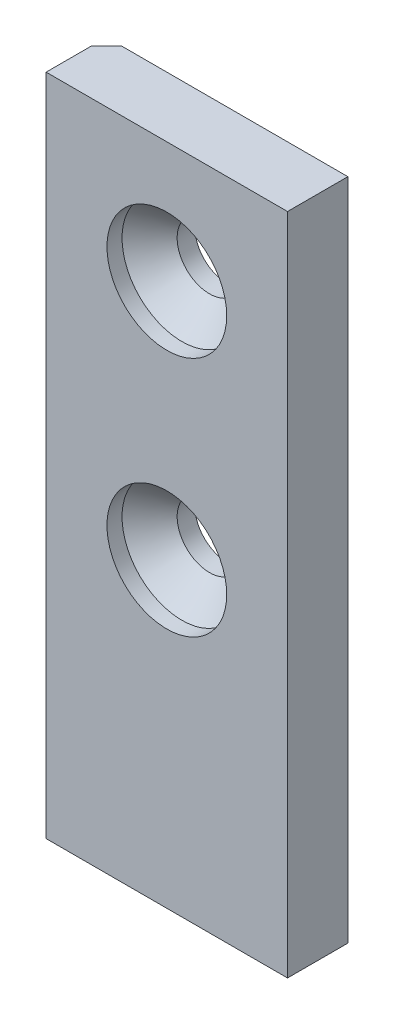
ISO-10303-21;
HEADER;
FILE_DESCRIPTION(('STEP AP214'),'2;1');
FILE_NAME('part.step','',(''),(''),'','','');
FILE_SCHEMA(('AUTOMOTIVE_DESIGN { 1 0 10303 214 1 1 1 1 }'));
ENDSEC;
DATA;
#1=APPLICATION_CONTEXT('core data for automotive mechanical design processes');
#2=APPLICATION_PROTOCOL_DEFINITION('international standard','automotive_design',2000,#1);
#3=PRODUCT_CONTEXT('',#1,'mechanical');
#4=PRODUCT('Part','Part','',(#3));
#5=PRODUCT_RELATED_PRODUCT_CATEGORY('part','',(#4));
#6=PRODUCT_DEFINITION_FORMATION('','',#4);
#7=PRODUCT_DEFINITION_CONTEXT('part definition',#1,'design');
#8=PRODUCT_DEFINITION('design','',#6,#7);
#9=PRODUCT_DEFINITION_SHAPE('','',#8);
#10=(LENGTH_UNIT() NAMED_UNIT(*) SI_UNIT(.MILLI.,.METRE.));
#11=(NAMED_UNIT(*) PLANE_ANGLE_UNIT() SI_UNIT($,.RADIAN.));
#12=(NAMED_UNIT(*) SI_UNIT($,.STERADIAN.) SOLID_ANGLE_UNIT());
#13=UNCERTAINTY_MEASURE_WITH_UNIT(LENGTH_MEASURE(1.E-05),#10,'distance_accuracy_value','');
#14=(GEOMETRIC_REPRESENTATION_CONTEXT(3) GLOBAL_UNCERTAINTY_ASSIGNED_CONTEXT((#13)) GLOBAL_UNIT_ASSIGNED_CONTEXT((#10,
#11,#12)) REPRESENTATION_CONTEXT('',''));
#15=CARTESIAN_POINT('',(0.,0.,0.));
#16=DIRECTION('',(0.,0.,1.));
#17=DIRECTION('',(1.,0.,0.));
#18=AXIS2_PLACEMENT_3D('',#15,#16,#17);
#19=CARTESIAN_POINT('',(-6.35000000000001,17.4624999999997,3.17500000000004));
#20=DIRECTION('',(1.,0.,0.));
#21=DIRECTION('',(0.,0.,-1.));
#22=AXIS2_PLACEMENT_3D('',#19,#20,#21);
#23=PLANE('',#22);
#24=DIRECTION('',(0.,0.707106781186547,0.707106781186548));
#25=VECTOR('',#24,1.);
#26=CARTESIAN_POINT('',(-6.35000000000001,18.6531250000002,1.98437500000004));
#27=LINE('',#26,#25);
#28=CARTESIAN_POINT('',(-6.35000000000001,16.66875,0.));
#29=VERTEX_POINT('',#28);
#30=CARTESIAN_POINT('',(-6.35000000000001,17.4624999999997,0.793750000000037));
#31=VERTEX_POINT('',#30);
#32=EDGE_CURVE('E101',#29,#31,#27,.T.);
#33=ORIENTED_EDGE('',*,*,#32,.F.);
#34=DIRECTION('',(0.,-1.,0.));
#35=VECTOR('',#34,1.);
#36=CARTESIAN_POINT('',(-6.35000000000001,17.4624999999997,0.));
#37=LINE('',#36,#35);
#38=CARTESIAN_POINT('',(-6.35,-17.4624999999997,0.));
#39=VERTEX_POINT('',#38);
#40=EDGE_CURVE('E90',#29,#39,#37,.T.);
#41=ORIENTED_EDGE('',*,*,#40,.T.);
#42=DIRECTION('',(0.,0.,-1.));
#43=VECTOR('',#42,1.);
#44=CARTESIAN_POINT('',(-6.35,-17.4624999999997,3.17500000000004));
#45=LINE('',#44,#43);
#46=CARTESIAN_POINT('',(-6.35,-17.4624999999997,3.17500000000004));
#47=VERTEX_POINT('',#46);
#48=EDGE_CURVE('E105',#47,#39,#45,.T.);
#49=ORIENTED_EDGE('',*,*,#48,.F.);
#50=DIRECTION('',(0.,-1.,0.));
#51=VECTOR('',#50,1.);
#52=CARTESIAN_POINT('',(-6.35000000000001,17.4624999999997,3.17500000000004));
#53=LINE('',#52,#51);
#54=CARTESIAN_POINT('',(-6.35000000000001,17.4624999999997,3.17500000000004));
#55=VERTEX_POINT('',#54);
#56=EDGE_CURVE('E120',#55,#47,#53,.T.);
#57=ORIENTED_EDGE('',*,*,#56,.F.);
#58=DIRECTION('',(0.,0.,-1.));
#59=VECTOR('',#58,1.);
#60=CARTESIAN_POINT('',(-6.35000000000001,17.4624999999997,3.17500000000004));
#61=LINE('',#60,#59);
#62=EDGE_CURVE('E103',#55,#31,#61,.T.);
#63=ORIENTED_EDGE('',*,*,#62,.T.);
#64=EDGE_LOOP('',(#33,#41,#49,#57,#63));
#65=FACE_BOUND('',#64,.T.);
#66=ADVANCED_FACE('F47',(#65),#23,.F.);
#67=CARTESIAN_POINT('',(-6.35,-17.4624999999997,3.17500000000004));
#68=DIRECTION('',(0.,1.,0.));
#69=DIRECTION('',(0.,0.,1.));
#70=AXIS2_PLACEMENT_3D('',#67,#68,#69);
#71=PLANE('',#70);
#72=DIRECTION('',(1.,0.,0.));
#73=VECTOR('',#72,1.);
#74=CARTESIAN_POINT('',(-6.35,-17.4624999999997,0.));
#75=LINE('',#74,#73);
#76=CARTESIAN_POINT('',(6.35000000000001,-17.4624999999997,0.));
#77=VERTEX_POINT('',#76);
#78=EDGE_CURVE('E94',#39,#77,#75,.T.);
#79=ORIENTED_EDGE('',*,*,#78,.T.);
#80=DIRECTION('',(0.,0.,-1.));
#81=VECTOR('',#80,1.);
#82=CARTESIAN_POINT('',(6.35000000000001,-17.4624999999997,3.17500000000004));
#83=LINE('',#82,#81);
#84=CARTESIAN_POINT('',(6.35000000000001,-17.4624999999997,3.17500000000004));
#85=VERTEX_POINT('',#84);
#86=EDGE_CURVE('E110',#85,#77,#83,.T.);
#87=ORIENTED_EDGE('',*,*,#86,.F.);
#88=DIRECTION('',(1.,0.,0.));
#89=VECTOR('',#88,1.);
#90=CARTESIAN_POINT('',(-6.35,-17.4624999999997,3.17500000000004));
#91=LINE('',#90,#89);
#92=EDGE_CURVE('E127',#47,#85,#91,.T.);
#93=ORIENTED_EDGE('',*,*,#92,.F.);
#94=ORIENTED_EDGE('',*,*,#48,.T.);
#95=EDGE_LOOP('',(#79,#87,#93,#94));
#96=FACE_BOUND('',#95,.T.);
#97=ADVANCED_FACE('F167',(#96),#71,.F.);
#98=CARTESIAN_POINT('',(6.35000000000001,17.4624999999997,3.17500000000004));
#99=DIRECTION('',(-1.,0.,0.));
#100=DIRECTION('',(0.,0.,1.));
#101=AXIS2_PLACEMENT_3D('',#98,#99,#100);
#102=PLANE('',#101);
#103=DIRECTION('',(0.,1.,0.));
#104=VECTOR('',#103,1.);
#105=CARTESIAN_POINT('',(6.35000000000001,17.4624999999997,0.));
#106=LINE('',#105,#104);
#107=CARTESIAN_POINT('',(6.35000000000001,17.4624999999997,0.));
#108=VERTEX_POINT('',#107);
#109=EDGE_CURVE('E121',#77,#108,#106,.T.);
#110=ORIENTED_EDGE('',*,*,#109,.T.);
#111=DIRECTION('',(0.,0.,-1.));
#112=VECTOR('',#111,1.);
#113=CARTESIAN_POINT('',(6.35000000000001,17.4624999999997,3.17500000000004));
#114=LINE('',#113,#112);
#115=CARTESIAN_POINT('',(6.35000000000001,17.4624999999997,3.17500000000004));
#116=VERTEX_POINT('',#115);
#117=EDGE_CURVE('E113',#116,#108,#114,.T.);
#118=ORIENTED_EDGE('',*,*,#117,.F.);
#119=DIRECTION('',(0.,1.,0.));
#120=VECTOR('',#119,1.);
#121=CARTESIAN_POINT('',(6.35000000000001,17.4624999999997,3.17500000000004));
#122=LINE('',#121,#120);
#123=EDGE_CURVE('E125',#85,#116,#122,.T.);
#124=ORIENTED_EDGE('',*,*,#123,.F.);
#125=ORIENTED_EDGE('',*,*,#86,.T.);
#126=EDGE_LOOP('',(#110,#118,#124,#125));
#127=FACE_BOUND('',#126,.T.);
#128=ADVANCED_FACE('F171',(#127),#102,.F.);
#129=CARTESIAN_POINT('',(-6.35000000000001,17.4624999999997,3.17500000000004));
#130=DIRECTION('',(0.,-1.,0.));
#131=DIRECTION('',(0.,0.,-1.));
#132=AXIS2_PLACEMENT_3D('',#129,#130,#131);
#133=PLANE('',#132);
#134=DIRECTION('',(0.707106781186548,0.,-0.707106781186547));
#135=VECTOR('',#134,1.);
#136=CARTESIAN_POINT('',(-7.54062500000001,17.4624999999997,1.98437500000004));
#137=LINE('',#136,#135);
#138=CARTESIAN_POINT('',(-5.55625,17.4624999999997,0.));
#139=VERTEX_POINT('',#138);
#140=EDGE_CURVE('E54',#31,#139,#137,.T.);
#141=ORIENTED_EDGE('',*,*,#140,.F.);
#142=ORIENTED_EDGE('',*,*,#62,.F.);
#143=DIRECTION('',(-1.,0.,0.));
#144=VECTOR('',#143,1.);
#145=CARTESIAN_POINT('',(-6.35000000000001,17.4624999999997,3.17500000000004));
#146=LINE('',#145,#144);
#147=EDGE_CURVE('E117',#116,#55,#146,.T.);
#148=ORIENTED_EDGE('',*,*,#147,.F.);
#149=ORIENTED_EDGE('',*,*,#117,.T.);
#150=DIRECTION('',(-1.,0.,0.));
#151=VECTOR('',#150,1.);
#152=CARTESIAN_POINT('',(-6.35000000000001,17.4624999999997,0.));
#153=LINE('',#152,#151);
#154=EDGE_CURVE('E118',#108,#139,#153,.T.);
#155=ORIENTED_EDGE('',*,*,#154,.T.);
#156=EDGE_LOOP('',(#141,#142,#148,#149,#155));
#157=FACE_BOUND('',#156,.T.);
#158=ADVANCED_FACE('F160',(#157),#133,.F.);
#159=CARTESIAN_POINT('',(0.,0.,3.17500000000004));
#160=DIRECTION('',(0.,0.,1.));
#161=DIRECTION('',(1.,0.,0.));
#162=AXIS2_PLACEMENT_3D('',#159,#160,#161);
#163=PLANE('',#162);
#164=CARTESIAN_POINT('',(0.,-1.5875000000003,3.17500000000004));
#165=DIRECTION('',(0.,0.,1.));
#166=DIRECTION('',(1.,0.,0.));
#167=AXIS2_PLACEMENT_3D('',#164,#165,#166);
#168=CIRCLE('',#167,3.15);
#169=CARTESIAN_POINT('',(3.15,-1.5875000000003,3.17500000000004));
#170=VERTEX_POINT('',#169);
#171=EDGE_CURVE('E151',#170,#170,#168,.T.);
#172=ORIENTED_EDGE('',*,*,#171,.F.);
#173=EDGE_LOOP('',(#172));
#174=FACE_BOUND('',#173,.T.);
#175=CARTESIAN_POINT('',(0.,11.1125000000003,3.17500000000004));
#176=DIRECTION('',(0.,0.,1.));
#177=DIRECTION('',(1.,0.,0.));
#178=AXIS2_PLACEMENT_3D('',#175,#176,#177);
#179=CIRCLE('',#178,3.15);
#180=CARTESIAN_POINT('',(3.15,11.1125000000003,3.17500000000004));
#181=VERTEX_POINT('',#180);
#182=EDGE_CURVE('E139',#181,#181,#179,.T.);
#183=ORIENTED_EDGE('',*,*,#182,.F.);
#184=EDGE_LOOP('',(#183));
#185=FACE_BOUND('',#184,.T.);
#186=ORIENTED_EDGE('',*,*,#56,.T.);
#187=ORIENTED_EDGE('',*,*,#92,.T.);
#188=ORIENTED_EDGE('',*,*,#123,.T.);
#189=ORIENTED_EDGE('',*,*,#147,.T.);
#190=EDGE_LOOP('',(#186,#187,#188,#189));
#191=FACE_BOUND('',#190,.T.);
#192=ADVANCED_FACE('F157',(#174,#185,#191),#163,.T.);
#193=CARTESIAN_POINT('',(0.,0.,0.));
#194=DIRECTION('',(0.,0.,1.));
#195=DIRECTION('',(1.,0.,0.));
#196=AXIS2_PLACEMENT_3D('',#193,#194,#195);
#197=PLANE('',#196);
#198=CARTESIAN_POINT('',(0.,-1.5875000000003,0.));
#199=DIRECTION('',(0.,0.,1.));
#200=DIRECTION('',(1.,0.,0.));
#201=AXIS2_PLACEMENT_3D('',#198,#199,#200);
#202=CIRCLE('',#201,1.70000000000001);
#203=CARTESIAN_POINT('',(1.70000000000001,-1.5875000000003,0.));
#204=VERTEX_POINT('',#203);
#205=EDGE_CURVE('E142',#204,#204,#202,.T.);
#206=ORIENTED_EDGE('',*,*,#205,.T.);
#207=EDGE_LOOP('',(#206));
#208=FACE_BOUND('',#207,.T.);
#209=CARTESIAN_POINT('',(0.,11.1125000000003,0.));
#210=DIRECTION('',(0.,0.,1.));
#211=DIRECTION('',(1.,0.,0.));
#212=AXIS2_PLACEMENT_3D('',#209,#210,#211);
#213=CIRCLE('',#212,1.70000000000001);
#214=CARTESIAN_POINT('',(1.70000000000001,11.1125000000003,0.));
#215=VERTEX_POINT('',#214);
#216=EDGE_CURVE('E98',#215,#215,#213,.T.);
#217=ORIENTED_EDGE('',*,*,#216,.T.);
#218=EDGE_LOOP('',(#217));
#219=FACE_BOUND('',#218,.T.);
#220=DIRECTION('',(-0.707106781186548,-0.707106781186547,0.));
#221=VECTOR('',#220,1.);
#222=CARTESIAN_POINT('',(-11.509375,11.5093750000002,0.));
#223=LINE('',#222,#221);
#224=EDGE_CURVE('E12',#139,#29,#223,.T.);
#225=ORIENTED_EDGE('',*,*,#224,.F.);
#226=ORIENTED_EDGE('',*,*,#154,.F.);
#227=ORIENTED_EDGE('',*,*,#109,.F.);
#228=ORIENTED_EDGE('',*,*,#78,.F.);
#229=ORIENTED_EDGE('',*,*,#40,.F.);
#230=EDGE_LOOP('',(#225,#226,#227,#228,#229));
#231=FACE_BOUND('',#230,.T.);
#232=ADVANCED_FACE('F92',(#208,#219,#231),#197,.F.);
#233=CARTESIAN_POINT('',(-7.67291666666668,7.67291666666647,-7.6729166666667));
#234=DIRECTION('',(-0.577350269189625,0.577350269189627,-0.577350269189626));
#235=DIRECTION('',(0.,0.707106781186547,0.707106781186548));
#236=AXIS2_PLACEMENT_3D('',#233,#234,#235);
#237=PLANE('',#236);
#238=ORIENTED_EDGE('',*,*,#224,.T.);
#239=ORIENTED_EDGE('',*,*,#32,.T.);
#240=ORIENTED_EDGE('',*,*,#140,.T.);
#241=EDGE_LOOP('',(#238,#239,#240));
#242=FACE_BOUND('',#241,.T.);
#243=ADVANCED_FACE('F107',(#242),#237,.T.);
#244=CARTESIAN_POINT('',(0.,11.1125000000003,3.17500000000004));
#245=DIRECTION('',(0.,0.,1.));
#246=DIRECTION('',(1.,0.,0.));
#247=AXIS2_PLACEMENT_3D('',#244,#245,#246);
#248=CYLINDRICAL_SURFACE('',#247,1.70000000000001);
#249=ORIENTED_EDGE('',*,*,#216,.F.);
#250=EDGE_LOOP('',(#249));
#251=FACE_BOUND('',#250,.T.);
#252=CARTESIAN_POINT('',(0.,11.1125000000003,0.93125000000005));
#253=DIRECTION('',(0.,0.,1.));
#254=DIRECTION('',(1.,0.,0.));
#255=AXIS2_PLACEMENT_3D('',#252,#253,#254);
#256=CIRCLE('',#255,1.7);
#257=CARTESIAN_POINT('',(1.7,11.1125000000003,0.93125000000005));
#258=VERTEX_POINT('',#257);
#259=EDGE_CURVE('E133',#258,#258,#256,.T.);
#260=ORIENTED_EDGE('',*,*,#259,.T.);
#261=EDGE_LOOP('',(#260));
#262=FACE_BOUND('',#261,.T.);
#263=ADVANCED_FACE('F210',(#251,#262),#248,.F.);
#264=CARTESIAN_POINT('',(0.,11.1125000000003,2.38125));
#265=DIRECTION('',(0.,0.,1.));
#266=DIRECTION('',(1.,0.,0.));
#267=AXIS2_PLACEMENT_3D('',#264,#265,#266);
#268=CONICAL_SURFACE('',#267,3.15,0.785398163397449);
#269=ORIENTED_EDGE('',*,*,#259,.F.);
#270=EDGE_LOOP('',(#269));
#271=FACE_BOUND('',#270,.T.);
#272=CARTESIAN_POINT('',(0.,11.1125000000003,2.38125));
#273=DIRECTION('',(0.,0.,1.));
#274=DIRECTION('',(1.,0.,0.));
#275=AXIS2_PLACEMENT_3D('',#272,#273,#274);
#276=CIRCLE('',#275,3.15);
#277=CARTESIAN_POINT('',(3.15,11.1125000000003,2.38125));
#278=VERTEX_POINT('',#277);
#279=EDGE_CURVE('E136',#278,#278,#276,.T.);
#280=ORIENTED_EDGE('',*,*,#279,.T.);
#281=EDGE_LOOP('',(#280));
#282=FACE_BOUND('',#281,.T.);
#283=ADVANCED_FACE('F217',(#271,#282),#268,.F.);
#284=CARTESIAN_POINT('',(0.,11.1125000000003,3.17500000000004));
#285=DIRECTION('',(0.,0.,1.));
#286=DIRECTION('',(1.,0.,0.));
#287=AXIS2_PLACEMENT_3D('',#284,#285,#286);
#288=CYLINDRICAL_SURFACE('',#287,3.15);
#289=ORIENTED_EDGE('',*,*,#279,.F.);
#290=EDGE_LOOP('',(#289));
#291=FACE_BOUND('',#290,.T.);
#292=ORIENTED_EDGE('',*,*,#182,.T.);
#293=EDGE_LOOP('',(#292));
#294=FACE_BOUND('',#293,.T.);
#295=ADVANCED_FACE('F225',(#291,#294),#288,.F.);
#296=CARTESIAN_POINT('',(0.,-1.5875000000003,3.17500000000004));
#297=DIRECTION('',(0.,0.,1.));
#298=DIRECTION('',(1.,0.,0.));
#299=AXIS2_PLACEMENT_3D('',#296,#297,#298);
#300=CYLINDRICAL_SURFACE('',#299,1.70000000000001);
#301=ORIENTED_EDGE('',*,*,#205,.F.);
#302=EDGE_LOOP('',(#301));
#303=FACE_BOUND('',#302,.T.);
#304=CARTESIAN_POINT('',(0.,-1.5875000000003,0.93125000000005));
#305=DIRECTION('',(0.,0.,1.));
#306=DIRECTION('',(1.,0.,0.));
#307=AXIS2_PLACEMENT_3D('',#304,#305,#306);
#308=CIRCLE('',#307,1.7);
#309=CARTESIAN_POINT('',(1.7,-1.5875000000003,0.93125000000005));
#310=VERTEX_POINT('',#309);
#311=EDGE_CURVE('E145',#310,#310,#308,.T.);
#312=ORIENTED_EDGE('',*,*,#311,.T.);
#313=EDGE_LOOP('',(#312));
#314=FACE_BOUND('',#313,.T.);
#315=ADVANCED_FACE('F233',(#303,#314),#300,.F.);
#316=CARTESIAN_POINT('',(0.,-1.5875000000003,2.38125));
#317=DIRECTION('',(0.,0.,1.));
#318=DIRECTION('',(1.,0.,0.));
#319=AXIS2_PLACEMENT_3D('',#316,#317,#318);
#320=CONICAL_SURFACE('',#319,3.15,0.785398163397449);
#321=ORIENTED_EDGE('',*,*,#311,.F.);
#322=EDGE_LOOP('',(#321));
#323=FACE_BOUND('',#322,.T.);
#324=CARTESIAN_POINT('',(0.,-1.5875000000003,2.38125));
#325=DIRECTION('',(0.,0.,1.));
#326=DIRECTION('',(1.,0.,0.));
#327=AXIS2_PLACEMENT_3D('',#324,#325,#326);
#328=CIRCLE('',#327,3.15);
#329=CARTESIAN_POINT('',(3.15,-1.5875000000003,2.38125));
#330=VERTEX_POINT('',#329);
#331=EDGE_CURVE('E148',#330,#330,#328,.T.);
#332=ORIENTED_EDGE('',*,*,#331,.T.);
#333=EDGE_LOOP('',(#332));
#334=FACE_BOUND('',#333,.T.);
#335=ADVANCED_FACE('F242',(#323,#334),#320,.F.);
#336=CARTESIAN_POINT('',(0.,-1.5875000000003,3.17500000000004));
#337=DIRECTION('',(0.,0.,1.));
#338=DIRECTION('',(1.,0.,0.));
#339=AXIS2_PLACEMENT_3D('',#336,#337,#338);
#340=CYLINDRICAL_SURFACE('',#339,3.15);
#341=ORIENTED_EDGE('',*,*,#331,.F.);
#342=EDGE_LOOP('',(#341));
#343=FACE_BOUND('',#342,.T.);
#344=ORIENTED_EDGE('',*,*,#171,.T.);
#345=EDGE_LOOP('',(#344));
#346=FACE_BOUND('',#345,.T.);
#347=ADVANCED_FACE('F155',(#343,#346),#340,.F.);
#348=CLOSED_SHELL('',(#66,#97,#128,#158,#192,#232,#243,#263,#283,#295,#315,#335,#347));
#349=MANIFOLD_SOLID_BREP('B2',#348);
#350=ADVANCED_BREP_SHAPE_REPRESENTATION('',(#18,#349),#14);
#351=SHAPE_DEFINITION_REPRESENTATION(#9,#350);
ENDSEC;
END-ISO-10303-21;
